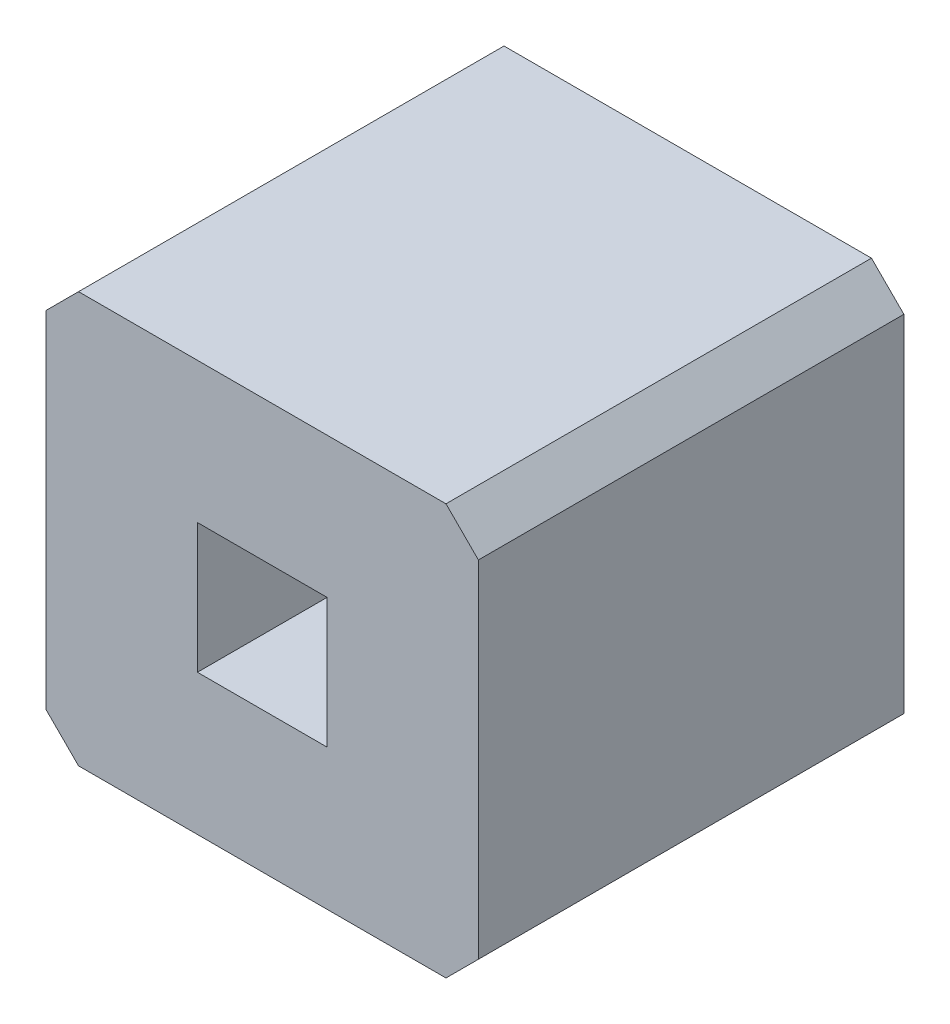
ISO-10303-21;
HEADER;
FILE_DESCRIPTION(('STEP AP214'),'2;1');
FILE_NAME('part.step','',(''),(''),'','','');
FILE_SCHEMA(('AUTOMOTIVE_DESIGN { 1 0 10303 214 1 1 1 1 }'));
ENDSEC;
DATA;
#1=APPLICATION_CONTEXT('core data for automotive mechanical design processes');
#2=APPLICATION_PROTOCOL_DEFINITION('international standard','automotive_design',2000,#1);
#3=PRODUCT_CONTEXT('',#1,'mechanical');
#4=PRODUCT('Part','Part','',(#3));
#5=PRODUCT_RELATED_PRODUCT_CATEGORY('part','',(#4));
#6=PRODUCT_DEFINITION_FORMATION('','',#4);
#7=PRODUCT_DEFINITION_CONTEXT('part definition',#1,'design');
#8=PRODUCT_DEFINITION('design','',#6,#7);
#9=PRODUCT_DEFINITION_SHAPE('','',#8);
#10=(LENGTH_UNIT() NAMED_UNIT(*) SI_UNIT(.MILLI.,.METRE.));
#11=(NAMED_UNIT(*) PLANE_ANGLE_UNIT() SI_UNIT($,.RADIAN.));
#12=(NAMED_UNIT(*) SI_UNIT($,.STERADIAN.) SOLID_ANGLE_UNIT());
#13=UNCERTAINTY_MEASURE_WITH_UNIT(LENGTH_MEASURE(1.E-05),#10,'distance_accuracy_value','');
#14=(GEOMETRIC_REPRESENTATION_CONTEXT(3) GLOBAL_UNCERTAINTY_ASSIGNED_CONTEXT((#13)) GLOBAL_UNIT_ASSIGNED_CONTEXT((#10,
#11,#12)) REPRESENTATION_CONTEXT('',''));
#15=CARTESIAN_POINT('',(0.,0.,0.));
#16=DIRECTION('',(0.,0.,1.));
#17=DIRECTION('',(1.,0.,0.));
#18=AXIS2_PLACEMENT_3D('',#15,#16,#17);
#19=CARTESIAN_POINT('',(-1.0795,-1.2065,2.50000008));
#20=DIRECTION('',(0.,0.,-1.));
#21=DIRECTION('',(0.,-1.,0.));
#22=AXIS2_PLACEMENT_3D('',#19,#20,#21);
#23=PLANE('',#22);
#24=DIRECTION('',(1.,0.,0.));
#25=VECTOR('',#24,1.);
#26=CARTESIAN_POINT('',(-0.381,0.381,2.50000008));
#27=LINE('',#26,#25);
#28=CARTESIAN_POINT('',(-0.381,0.381,2.50000008));
#29=VERTEX_POINT('',#28);
#30=CARTESIAN_POINT('',(0.381,0.381,2.50000008));
#31=VERTEX_POINT('',#30);
#32=EDGE_CURVE('E255',#29,#31,#27,.T.);
#33=ORIENTED_EDGE('',*,*,#32,.T.);
#34=DIRECTION('',(0.,-1.,0.));
#35=VECTOR('',#34,1.);
#36=CARTESIAN_POINT('',(0.381,0.381,2.50000008));
#37=LINE('',#36,#35);
#38=CARTESIAN_POINT('',(0.381,-0.381,2.50000008));
#39=VERTEX_POINT('',#38);
#40=EDGE_CURVE('E196',#31,#39,#37,.T.);
#41=ORIENTED_EDGE('',*,*,#40,.T.);
#42=DIRECTION('',(-1.,0.,0.));
#43=VECTOR('',#42,1.);
#44=CARTESIAN_POINT('',(0.381,-0.381,2.50000008));
#45=LINE('',#44,#43);
#46=CARTESIAN_POINT('',(-0.381,-0.381,2.50000008));
#47=VERTEX_POINT('',#46);
#48=EDGE_CURVE('E11',#39,#47,#45,.T.);
#49=ORIENTED_EDGE('',*,*,#48,.T.);
#50=DIRECTION('',(0.,1.,0.));
#51=VECTOR('',#50,1.);
#52=CARTESIAN_POINT('',(-0.381,-0.381,2.50000008));
#53=LINE('',#52,#51);
#54=EDGE_CURVE('E243',#47,#29,#53,.T.);
#55=ORIENTED_EDGE('',*,*,#54,.T.);
#56=EDGE_LOOP('',(#33,#41,#49,#55));
#57=FACE_BOUND('',#56,.T.);
#58=DIRECTION('',(0.707106781186048,0.707106781187048,0.));
#59=VECTOR('',#58,1.);
#60=CARTESIAN_POINT('',(1.0795,-1.2065,2.50000008));
#61=LINE('',#60,#59);
#62=CARTESIAN_POINT('',(1.0795,-1.2065,2.50000008));
#63=VERTEX_POINT('',#62);
#64=CARTESIAN_POINT('',(1.27,-1.016,2.50000008));
#65=VERTEX_POINT('',#64);
#66=EDGE_CURVE('E134',#63,#65,#61,.T.);
#67=ORIENTED_EDGE('',*,*,#66,.T.);
#68=DIRECTION('',(0.,1.,0.));
#69=VECTOR('',#68,1.);
#70=CARTESIAN_POINT('',(1.27,-1.016,2.50000008));
#71=LINE('',#70,#69);
#72=CARTESIAN_POINT('',(1.27,1.016,2.50000008));
#73=VERTEX_POINT('',#72);
#74=EDGE_CURVE('E211',#65,#73,#71,.T.);
#75=ORIENTED_EDGE('',*,*,#74,.T.);
#76=DIRECTION('',(-0.707106781186048,0.707106781187048,0.));
#77=VECTOR('',#76,1.);
#78=CARTESIAN_POINT('',(1.27,1.016,2.50000008));
#79=LINE('',#78,#77);
#80=CARTESIAN_POINT('',(1.0795,1.2065,2.50000008));
#81=VERTEX_POINT('',#80);
#82=EDGE_CURVE('E225',#73,#81,#79,.T.);
#83=ORIENTED_EDGE('',*,*,#82,.T.);
#84=DIRECTION('',(-1.,0.,0.));
#85=VECTOR('',#84,1.);
#86=CARTESIAN_POINT('',(1.0795,1.2065,2.50000008));
#87=LINE('',#86,#85);
#88=CARTESIAN_POINT('',(-1.0795,1.2065,2.50000008));
#89=VERTEX_POINT('',#88);
#90=EDGE_CURVE('E232',#81,#89,#87,.T.);
#91=ORIENTED_EDGE('',*,*,#90,.T.);
#92=DIRECTION('',(-0.707106781186548,-0.707106781186548,0.));
#93=VECTOR('',#92,1.);
#94=CARTESIAN_POINT('',(-1.0795,1.2065,2.50000008));
#95=LINE('',#94,#93);
#96=CARTESIAN_POINT('',(-1.27,1.016,2.50000008));
#97=VERTEX_POINT('',#96);
#98=EDGE_CURVE('E187',#89,#97,#95,.T.);
#99=ORIENTED_EDGE('',*,*,#98,.T.);
#100=DIRECTION('',(0.,-1.,0.));
#101=VECTOR('',#100,1.);
#102=CARTESIAN_POINT('',(-1.27,1.016,2.50000008));
#103=LINE('',#102,#101);
#104=CARTESIAN_POINT('',(-1.27,-1.016,2.50000008));
#105=VERTEX_POINT('',#104);
#106=EDGE_CURVE('E200',#97,#105,#103,.T.);
#107=ORIENTED_EDGE('',*,*,#106,.T.);
#108=DIRECTION('',(0.707106781186548,-0.707106781186548,0.));
#109=VECTOR('',#108,1.);
#110=CARTESIAN_POINT('',(-1.27,-1.016,2.50000008));
#111=LINE('',#110,#109);
#112=CARTESIAN_POINT('',(-1.0795,-1.2065,2.50000008));
#113=VERTEX_POINT('',#112);
#114=EDGE_CURVE('E151',#105,#113,#111,.T.);
#115=ORIENTED_EDGE('',*,*,#114,.T.);
#116=DIRECTION('',(1.,0.,0.));
#117=VECTOR('',#116,1.);
#118=CARTESIAN_POINT('',(-1.0795,-1.2065,2.50000008));
#119=LINE('',#118,#117);
#120=EDGE_CURVE('E149',#113,#63,#119,.T.);
#121=ORIENTED_EDGE('',*,*,#120,.T.);
#122=EDGE_LOOP('',(#67,#75,#83,#91,#99,#107,#115,#121));
#123=FACE_BOUND('',#122,.T.);
#124=ADVANCED_FACE('F17',(#57,#123),#23,.F.);
#125=CARTESIAN_POINT('',(-1.0795,-1.2065,0.));
#126=DIRECTION('',(0.,0.,-1.));
#127=DIRECTION('',(0.,-1.,0.));
#128=AXIS2_PLACEMENT_3D('',#125,#126,#127);
#129=PLANE('',#128);
#130=DIRECTION('',(0.,1.,0.));
#131=VECTOR('',#130,1.);
#132=CARTESIAN_POINT('',(-0.381,-0.381,0.));
#133=LINE('',#132,#131);
#134=CARTESIAN_POINT('',(-0.381,-0.381,0.));
#135=VERTEX_POINT('',#134);
#136=CARTESIAN_POINT('',(-0.381,0.381,0.));
#137=VERTEX_POINT('',#136);
#138=EDGE_CURVE('E235',#135,#137,#133,.T.);
#139=ORIENTED_EDGE('',*,*,#138,.F.);
#140=DIRECTION('',(-1.,0.,0.));
#141=VECTOR('',#140,1.);
#142=CARTESIAN_POINT('',(0.381,-0.381,0.));
#143=LINE('',#142,#141);
#144=CARTESIAN_POINT('',(0.381,-0.381,0.));
#145=VERTEX_POINT('',#144);
#146=EDGE_CURVE('E25',#145,#135,#143,.T.);
#147=ORIENTED_EDGE('',*,*,#146,.F.);
#148=DIRECTION('',(0.,-1.,0.));
#149=VECTOR('',#148,1.);
#150=CARTESIAN_POINT('',(0.381,0.381,0.));
#151=LINE('',#150,#149);
#152=CARTESIAN_POINT('',(0.381,0.381,0.));
#153=VERTEX_POINT('',#152);
#154=EDGE_CURVE('E197',#153,#145,#151,.T.);
#155=ORIENTED_EDGE('',*,*,#154,.F.);
#156=DIRECTION('',(1.,0.,0.));
#157=VECTOR('',#156,1.);
#158=CARTESIAN_POINT('',(-0.381,0.381,0.));
#159=LINE('',#158,#157);
#160=EDGE_CURVE('E250',#137,#153,#159,.T.);
#161=ORIENTED_EDGE('',*,*,#160,.F.);
#162=EDGE_LOOP('',(#139,#147,#155,#161));
#163=FACE_BOUND('',#162,.T.);
#164=DIRECTION('',(1.,0.,0.));
#165=VECTOR('',#164,1.);
#166=CARTESIAN_POINT('',(-1.0795,-1.2065,0.));
#167=LINE('',#166,#165);
#168=CARTESIAN_POINT('',(-1.0795,-1.2065,0.));
#169=VERTEX_POINT('',#168);
#170=CARTESIAN_POINT('',(1.0795,-1.2065,0.));
#171=VERTEX_POINT('',#170);
#172=EDGE_CURVE('E160',#169,#171,#167,.T.);
#173=ORIENTED_EDGE('',*,*,#172,.F.);
#174=DIRECTION('',(0.707106781186548,-0.707106781186548,0.));
#175=VECTOR('',#174,1.);
#176=CARTESIAN_POINT('',(-1.27,-1.016,0.));
#177=LINE('',#176,#175);
#178=CARTESIAN_POINT('',(-1.27,-1.016,0.));
#179=VERTEX_POINT('',#178);
#180=EDGE_CURVE('E176',#179,#169,#177,.T.);
#181=ORIENTED_EDGE('',*,*,#180,.F.);
#182=DIRECTION('',(0.,-1.,0.));
#183=VECTOR('',#182,1.);
#184=CARTESIAN_POINT('',(-1.27,1.016,0.));
#185=LINE('',#184,#183);
#186=CARTESIAN_POINT('',(-1.27,1.016,0.));
#187=VERTEX_POINT('',#186);
#188=EDGE_CURVE('E146',#187,#179,#185,.T.);
#189=ORIENTED_EDGE('',*,*,#188,.F.);
#190=DIRECTION('',(-0.707106781186548,-0.707106781186548,0.));
#191=VECTOR('',#190,1.);
#192=CARTESIAN_POINT('',(-1.0795,1.2065,0.));
#193=LINE('',#192,#191);
#194=CARTESIAN_POINT('',(-1.0795,1.2065,0.));
#195=VERTEX_POINT('',#194);
#196=EDGE_CURVE('E190',#195,#187,#193,.T.);
#197=ORIENTED_EDGE('',*,*,#196,.F.);
#198=DIRECTION('',(-1.,0.,0.));
#199=VECTOR('',#198,1.);
#200=CARTESIAN_POINT('',(1.0795,1.2065,0.));
#201=LINE('',#200,#199);
#202=CARTESIAN_POINT('',(1.0795,1.2065,0.));
#203=VERTEX_POINT('',#202);
#204=EDGE_CURVE('E229',#203,#195,#201,.T.);
#205=ORIENTED_EDGE('',*,*,#204,.F.);
#206=DIRECTION('',(-0.707106781186048,0.707106781187048,0.));
#207=VECTOR('',#206,1.);
#208=CARTESIAN_POINT('',(1.27,1.016,0.));
#209=LINE('',#208,#207);
#210=CARTESIAN_POINT('',(1.27,1.016,0.));
#211=VERTEX_POINT('',#210);
#212=EDGE_CURVE('E212',#211,#203,#209,.T.);
#213=ORIENTED_EDGE('',*,*,#212,.F.);
#214=DIRECTION('',(0.,1.,0.));
#215=VECTOR('',#214,1.);
#216=CARTESIAN_POINT('',(1.27,-1.016,0.));
#217=LINE('',#216,#215);
#218=CARTESIAN_POINT('',(1.27,-1.016,0.));
#219=VERTEX_POINT('',#218);
#220=EDGE_CURVE('E170',#219,#211,#217,.T.);
#221=ORIENTED_EDGE('',*,*,#220,.F.);
#222=DIRECTION('',(0.707106781186048,0.707106781187048,0.));
#223=VECTOR('',#222,1.);
#224=CARTESIAN_POINT('',(1.0795,-1.2065,0.));
#225=LINE('',#224,#223);
#226=EDGE_CURVE('E173',#171,#219,#225,.T.);
#227=ORIENTED_EDGE('',*,*,#226,.F.);
#228=EDGE_LOOP('',(#173,#181,#189,#197,#205,#213,#221,#227));
#229=FACE_BOUND('',#228,.T.);
#230=ADVANCED_FACE('F271',(#163,#229),#129,.T.);
#231=CARTESIAN_POINT('',(0.381,-0.381,0.));
#232=DIRECTION('',(0.,-1.,0.));
#233=DIRECTION('',(0.,0.,-1.));
#234=AXIS2_PLACEMENT_3D('',#231,#232,#233);
#235=PLANE('',#234);
#236=ORIENTED_EDGE('',*,*,#146,.T.);
#237=DIRECTION('',(0.,0.,1.));
#238=VECTOR('',#237,1.);
#239=CARTESIAN_POINT('',(-0.381,-0.381,0.));
#240=LINE('',#239,#238);
#241=EDGE_CURVE('E247',#135,#47,#240,.T.);
#242=ORIENTED_EDGE('',*,*,#241,.T.);
#243=ORIENTED_EDGE('',*,*,#48,.F.);
#244=DIRECTION('',(0.,0.,1.));
#245=VECTOR('',#244,1.);
#246=CARTESIAN_POINT('',(0.381,-0.381,0.));
#247=LINE('',#246,#245);
#248=EDGE_CURVE('E192',#145,#39,#247,.T.);
#249=ORIENTED_EDGE('',*,*,#248,.F.);
#250=EDGE_LOOP('',(#236,#242,#243,#249));
#251=FACE_BOUND('',#250,.T.);
#252=ADVANCED_FACE('F267',(#251),#235,.F.);
#253=CARTESIAN_POINT('',(0.381,0.381,0.));
#254=DIRECTION('',(1.,0.,0.));
#255=DIRECTION('',(0.,1.,0.));
#256=AXIS2_PLACEMENT_3D('',#253,#254,#255);
#257=PLANE('',#256);
#258=ORIENTED_EDGE('',*,*,#154,.T.);
#259=ORIENTED_EDGE('',*,*,#248,.T.);
#260=ORIENTED_EDGE('',*,*,#40,.F.);
#261=DIRECTION('',(0.,0.,1.));
#262=VECTOR('',#261,1.);
#263=CARTESIAN_POINT('',(0.381,0.381,0.));
#264=LINE('',#263,#262);
#265=EDGE_CURVE('E251',#153,#31,#264,.T.);
#266=ORIENTED_EDGE('',*,*,#265,.F.);
#267=EDGE_LOOP('',(#258,#259,#260,#266));
#268=FACE_BOUND('',#267,.T.);
#269=ADVANCED_FACE('F282',(#268),#257,.F.);
#270=CARTESIAN_POINT('',(-0.381,0.381,0.));
#271=DIRECTION('',(0.,1.,0.));
#272=DIRECTION('',(1.,0.,0.));
#273=AXIS2_PLACEMENT_3D('',#270,#271,#272);
#274=PLANE('',#273);
#275=ORIENTED_EDGE('',*,*,#160,.T.);
#276=ORIENTED_EDGE('',*,*,#265,.T.);
#277=ORIENTED_EDGE('',*,*,#32,.F.);
#278=DIRECTION('',(0.,0.,1.));
#279=VECTOR('',#278,1.);
#280=CARTESIAN_POINT('',(-0.381,0.381,0.));
#281=LINE('',#280,#279);
#282=EDGE_CURVE('E239',#137,#29,#281,.T.);
#283=ORIENTED_EDGE('',*,*,#282,.F.);
#284=EDGE_LOOP('',(#275,#276,#277,#283));
#285=FACE_BOUND('',#284,.T.);
#286=ADVANCED_FACE('F279',(#285),#274,.F.);
#287=CARTESIAN_POINT('',(-0.381,-0.381,0.));
#288=DIRECTION('',(-1.,0.,0.));
#289=DIRECTION('',(0.,0.,1.));
#290=AXIS2_PLACEMENT_3D('',#287,#288,#289);
#291=PLANE('',#290);
#292=ORIENTED_EDGE('',*,*,#138,.T.);
#293=ORIENTED_EDGE('',*,*,#282,.T.);
#294=ORIENTED_EDGE('',*,*,#54,.F.);
#295=ORIENTED_EDGE('',*,*,#241,.F.);
#296=EDGE_LOOP('',(#292,#293,#294,#295));
#297=FACE_BOUND('',#296,.T.);
#298=ADVANCED_FACE('F270',(#297),#291,.F.);
#299=CARTESIAN_POINT('',(1.0795,1.2065,0.));
#300=DIRECTION('',(0.,-1.,0.));
#301=DIRECTION('',(0.,0.,-1.));
#302=AXIS2_PLACEMENT_3D('',#299,#300,#301);
#303=PLANE('',#302);
#304=ORIENTED_EDGE('',*,*,#204,.T.);
#305=DIRECTION('',(0.,0.,1.));
#306=VECTOR('',#305,1.);
#307=CARTESIAN_POINT('',(-1.0795,1.2065,0.));
#308=LINE('',#307,#306);
#309=EDGE_CURVE('E189',#195,#89,#308,.T.);
#310=ORIENTED_EDGE('',*,*,#309,.T.);
#311=ORIENTED_EDGE('',*,*,#90,.F.);
#312=DIRECTION('',(0.,0.,1.));
#313=VECTOR('',#312,1.);
#314=CARTESIAN_POINT('',(1.0795,1.2065,0.));
#315=LINE('',#314,#313);
#316=EDGE_CURVE('E216',#203,#81,#315,.T.);
#317=ORIENTED_EDGE('',*,*,#316,.F.);
#318=EDGE_LOOP('',(#304,#310,#311,#317));
#319=FACE_BOUND('',#318,.T.);
#320=ADVANCED_FACE('F302',(#319),#303,.F.);
#321=CARTESIAN_POINT('',(1.27,1.016,0.));
#322=DIRECTION('',(-0.707106781187048,-0.707106781186048,0.));
#323=DIRECTION('',(-0.707106781186048,0.707106781187048,0.));
#324=AXIS2_PLACEMENT_3D('',#321,#322,#323);
#325=PLANE('',#324);
#326=ORIENTED_EDGE('',*,*,#212,.T.);
#327=ORIENTED_EDGE('',*,*,#316,.T.);
#328=ORIENTED_EDGE('',*,*,#82,.F.);
#329=DIRECTION('',(0.,0.,1.));
#330=VECTOR('',#329,1.);
#331=CARTESIAN_POINT('',(1.27,1.016,0.));
#332=LINE('',#331,#330);
#333=EDGE_CURVE('E207',#211,#73,#332,.T.);
#334=ORIENTED_EDGE('',*,*,#333,.F.);
#335=EDGE_LOOP('',(#326,#327,#328,#334));
#336=FACE_BOUND('',#335,.T.);
#337=ADVANCED_FACE('F304',(#336),#325,.F.);
#338=CARTESIAN_POINT('',(-1.0795,1.2065,0.));
#339=DIRECTION('',(0.707106781186548,-0.707106781186548,0.));
#340=DIRECTION('',(0.,0.,-1.));
#341=AXIS2_PLACEMENT_3D('',#338,#339,#340);
#342=PLANE('',#341);
#343=ORIENTED_EDGE('',*,*,#196,.T.);
#344=DIRECTION('',(0.,0.,1.));
#345=VECTOR('',#344,1.);
#346=CARTESIAN_POINT('',(-1.27,1.016,0.));
#347=LINE('',#346,#345);
#348=EDGE_CURVE('E203',#187,#97,#347,.T.);
#349=ORIENTED_EDGE('',*,*,#348,.T.);
#350=ORIENTED_EDGE('',*,*,#98,.F.);
#351=ORIENTED_EDGE('',*,*,#309,.F.);
#352=EDGE_LOOP('',(#343,#349,#350,#351));
#353=FACE_BOUND('',#352,.T.);
#354=ADVANCED_FACE('F310',(#353),#342,.F.);
#355=CARTESIAN_POINT('',(1.27,-1.016,0.));
#356=DIRECTION('',(-1.,0.,0.));
#357=DIRECTION('',(0.,0.,1.));
#358=AXIS2_PLACEMENT_3D('',#355,#356,#357);
#359=PLANE('',#358);
#360=ORIENTED_EDGE('',*,*,#220,.T.);
#361=ORIENTED_EDGE('',*,*,#333,.T.);
#362=ORIENTED_EDGE('',*,*,#74,.F.);
#363=DIRECTION('',(0.,0.,1.));
#364=VECTOR('',#363,1.);
#365=CARTESIAN_POINT('',(1.27,-1.016,0.));
#366=LINE('',#365,#364);
#367=EDGE_CURVE('E142',#219,#65,#366,.T.);
#368=ORIENTED_EDGE('',*,*,#367,.F.);
#369=EDGE_LOOP('',(#360,#361,#362,#368));
#370=FACE_BOUND('',#369,.T.);
#371=ADVANCED_FACE('F307',(#370),#359,.F.);
#372=CARTESIAN_POINT('',(-1.27,1.016,0.));
#373=DIRECTION('',(1.,0.,0.));
#374=DIRECTION('',(0.,1.,0.));
#375=AXIS2_PLACEMENT_3D('',#372,#373,#374);
#376=PLANE('',#375);
#377=ORIENTED_EDGE('',*,*,#188,.T.);
#378=DIRECTION('',(0.,0.,1.));
#379=VECTOR('',#378,1.);
#380=CARTESIAN_POINT('',(-1.27,-1.016,0.));
#381=LINE('',#380,#379);
#382=EDGE_CURVE('E181',#179,#105,#381,.T.);
#383=ORIENTED_EDGE('',*,*,#382,.T.);
#384=ORIENTED_EDGE('',*,*,#106,.F.);
#385=ORIENTED_EDGE('',*,*,#348,.F.);
#386=EDGE_LOOP('',(#377,#383,#384,#385));
#387=FACE_BOUND('',#386,.T.);
#388=ADVANCED_FACE('F309',(#387),#376,.F.);
#389=CARTESIAN_POINT('',(1.0795,-1.2065,0.));
#390=DIRECTION('',(-0.707106781187048,0.707106781186048,0.));
#391=DIRECTION('',(0.,0.,1.));
#392=AXIS2_PLACEMENT_3D('',#389,#390,#391);
#393=PLANE('',#392);
#394=ORIENTED_EDGE('',*,*,#226,.T.);
#395=ORIENTED_EDGE('',*,*,#367,.T.);
#396=ORIENTED_EDGE('',*,*,#66,.F.);
#397=DIRECTION('',(0.,0.,1.));
#398=VECTOR('',#397,1.);
#399=CARTESIAN_POINT('',(1.0795,-1.2065,0.));
#400=LINE('',#399,#398);
#401=EDGE_CURVE('E139',#171,#63,#400,.T.);
#402=ORIENTED_EDGE('',*,*,#401,.F.);
#403=EDGE_LOOP('',(#394,#395,#396,#402));
#404=FACE_BOUND('',#403,.T.);
#405=ADVANCED_FACE('F137',(#404),#393,.F.);
#406=CARTESIAN_POINT('',(-1.27,-1.016,0.));
#407=DIRECTION('',(0.707106781186548,0.707106781186548,0.));
#408=DIRECTION('',(0.,0.,-1.));
#409=AXIS2_PLACEMENT_3D('',#406,#407,#408);
#410=PLANE('',#409);
#411=ORIENTED_EDGE('',*,*,#180,.T.);
#412=DIRECTION('',(0.,0.,1.));
#413=VECTOR('',#412,1.);
#414=CARTESIAN_POINT('',(-1.0795,-1.2065,0.));
#415=LINE('',#414,#413);
#416=EDGE_CURVE('E156',#169,#113,#415,.T.);
#417=ORIENTED_EDGE('',*,*,#416,.T.);
#418=ORIENTED_EDGE('',*,*,#114,.F.);
#419=ORIENTED_EDGE('',*,*,#382,.F.);
#420=EDGE_LOOP('',(#411,#417,#418,#419));
#421=FACE_BOUND('',#420,.T.);
#422=ADVANCED_FACE('F318',(#421),#410,.F.);
#423=CARTESIAN_POINT('',(-1.0795,-1.2065,0.));
#424=DIRECTION('',(0.,1.,0.));
#425=DIRECTION('',(1.,0.,0.));
#426=AXIS2_PLACEMENT_3D('',#423,#424,#425);
#427=PLANE('',#426);
#428=ORIENTED_EDGE('',*,*,#172,.T.);
#429=ORIENTED_EDGE('',*,*,#401,.T.);
#430=ORIENTED_EDGE('',*,*,#120,.F.);
#431=ORIENTED_EDGE('',*,*,#416,.F.);
#432=EDGE_LOOP('',(#428,#429,#430,#431));
#433=FACE_BOUND('',#432,.T.);
#434=ADVANCED_FACE('F158',(#433),#427,.F.);
#435=CLOSED_SHELL('',(#124,#230,#252,#269,#286,#298,#320,#337,#354,#371,#388,#405,#422,#434));
#436=MANIFOLD_SOLID_BREP('B1',#435);
#437=ADVANCED_BREP_SHAPE_REPRESENTATION('',(#18,#436),#14);
#438=SHAPE_DEFINITION_REPRESENTATION(#9,#437);
ENDSEC;
END-ISO-10303-21;
